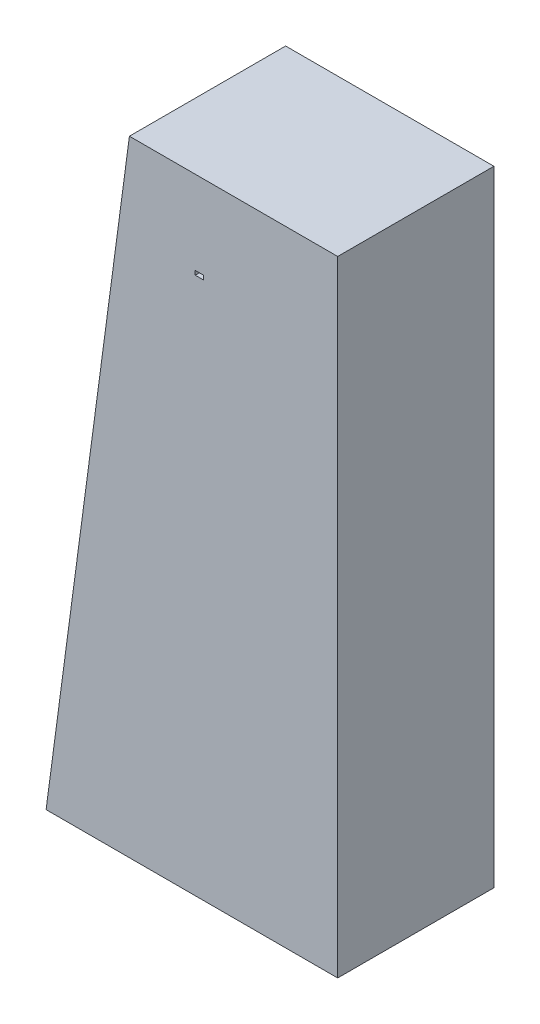
ISO-10303-21;
HEADER;
FILE_DESCRIPTION(('STEP AP214'),'2;1');
FILE_NAME('part.step','',(''),(''),'','','');
FILE_SCHEMA(('AUTOMOTIVE_DESIGN { 1 0 10303 214 1 1 1 1 }'));
ENDSEC;
DATA;
#1=APPLICATION_CONTEXT('core data for automotive mechanical design processes');
#2=APPLICATION_PROTOCOL_DEFINITION('international standard','automotive_design',2000,#1);
#3=PRODUCT_CONTEXT('',#1,'mechanical');
#4=PRODUCT('Part','Part','',(#3));
#5=PRODUCT_RELATED_PRODUCT_CATEGORY('part','',(#4));
#6=PRODUCT_DEFINITION_FORMATION('','',#4);
#7=PRODUCT_DEFINITION_CONTEXT('part definition',#1,'design');
#8=PRODUCT_DEFINITION('design','',#6,#7);
#9=PRODUCT_DEFINITION_SHAPE('','',#8);
#10=(LENGTH_UNIT() NAMED_UNIT(*) SI_UNIT(.MILLI.,.METRE.));
#11=(NAMED_UNIT(*) PLANE_ANGLE_UNIT() SI_UNIT($,.RADIAN.));
#12=(NAMED_UNIT(*) SI_UNIT($,.STERADIAN.) SOLID_ANGLE_UNIT());
#13=UNCERTAINTY_MEASURE_WITH_UNIT(LENGTH_MEASURE(1.E-05),#10,'distance_accuracy_value','');
#14=(GEOMETRIC_REPRESENTATION_CONTEXT(3) GLOBAL_UNCERTAINTY_ASSIGNED_CONTEXT((#13)) GLOBAL_UNIT_ASSIGNED_CONTEXT((#10,
#11,#12)) REPRESENTATION_CONTEXT('',''));
#15=CARTESIAN_POINT('',(0.,0.,0.));
#16=DIRECTION('',(0.,0.,1.));
#17=DIRECTION('',(1.,0.,0.));
#18=AXIS2_PLACEMENT_3D('',#15,#16,#17);
#19=CARTESIAN_POINT('',(20.,150.,18.75));
#20=DIRECTION('',(0.,1.,0.));
#21=DIRECTION('',(0.,0.,1.));
#22=AXIS2_PLACEMENT_3D('',#19,#20,#21);
#23=PLANE('',#22);
#24=DIRECTION('',(1.,0.,0.));
#25=VECTOR('',#24,1.);
#26=CARTESIAN_POINT('',(20.,150.,-18.75));
#27=LINE('',#26,#25);
#28=CARTESIAN_POINT('',(20.,150.,-18.75));
#29=VERTEX_POINT('',#28);
#30=CARTESIAN_POINT('',(70.,150.,-18.75));
#31=VERTEX_POINT('',#30);
#32=EDGE_CURVE('E188',#29,#31,#27,.T.);
#33=ORIENTED_EDGE('',*,*,#32,.F.);
#34=DIRECTION('',(0.,0.,-1.));
#35=VECTOR('',#34,1.);
#36=CARTESIAN_POINT('',(20.,150.,18.75));
#37=LINE('',#36,#35);
#38=CARTESIAN_POINT('',(20.,150.,18.75));
#39=VERTEX_POINT('',#38);
#40=EDGE_CURVE('E11',#39,#29,#37,.T.);
#41=ORIENTED_EDGE('',*,*,#40,.F.);
#42=DIRECTION('',(1.,0.,0.));
#43=VECTOR('',#42,1.);
#44=CARTESIAN_POINT('',(20.,150.,18.75));
#45=LINE('',#44,#43);
#46=CARTESIAN_POINT('',(70.,150.,18.75));
#47=VERTEX_POINT('',#46);
#48=EDGE_CURVE('E194',#39,#47,#45,.T.);
#49=ORIENTED_EDGE('',*,*,#48,.T.);
#50=DIRECTION('',(0.,0.,-1.));
#51=VECTOR('',#50,1.);
#52=CARTESIAN_POINT('',(70.,150.,18.75));
#53=LINE('',#52,#51);
#54=EDGE_CURVE('E39',#47,#31,#53,.T.);
#55=ORIENTED_EDGE('',*,*,#54,.T.);
#56=EDGE_LOOP('',(#33,#41,#49,#55));
#57=FACE_BOUND('',#56,.T.);
#58=ADVANCED_FACE('F36',(#57),#23,.T.);
#59=CARTESIAN_POINT('',(0.,0.,18.75));
#60=DIRECTION('',(-0.991227900682635,0.132163720091018,0.));
#61=DIRECTION('',(-0.132163720091018,-0.991227900682635,0.));
#62=AXIS2_PLACEMENT_3D('',#59,#60,#61);
#63=PLANE('',#62);
#64=DIRECTION('',(0.132163720091018,0.991227900682635,0.));
#65=VECTOR('',#64,1.);
#66=CARTESIAN_POINT('',(0.,0.,-18.75));
#67=LINE('',#66,#65);
#68=CARTESIAN_POINT('',(0.,0.,-18.75));
#69=VERTEX_POINT('',#68);
#70=EDGE_CURVE('E198',#69,#29,#67,.T.);
#71=ORIENTED_EDGE('',*,*,#70,.F.);
#72=DIRECTION('',(0.,0.,-1.));
#73=VECTOR('',#72,1.);
#74=CARTESIAN_POINT('',(0.,0.,18.75));
#75=LINE('',#74,#73);
#76=CARTESIAN_POINT('',(0.,0.,18.75));
#77=VERTEX_POINT('',#76);
#78=EDGE_CURVE('E44',#77,#69,#75,.T.);
#79=ORIENTED_EDGE('',*,*,#78,.F.);
#80=DIRECTION('',(0.132163720091018,0.991227900682635,0.));
#81=VECTOR('',#80,1.);
#82=CARTESIAN_POINT('',(0.,0.,18.75));
#83=LINE('',#82,#81);
#84=EDGE_CURVE('E203',#77,#39,#83,.T.);
#85=ORIENTED_EDGE('',*,*,#84,.T.);
#86=ORIENTED_EDGE('',*,*,#40,.T.);
#87=EDGE_LOOP('',(#71,#79,#85,#86));
#88=FACE_BOUND('',#87,.T.);
#89=ADVANCED_FACE('F230',(#88),#63,.T.);
#90=CARTESIAN_POINT('',(0.,0.,18.75));
#91=DIRECTION('',(0.,1.,0.));
#92=DIRECTION('',(-1.,0.,0.));
#93=AXIS2_PLACEMENT_3D('',#90,#91,#92);
#94=PLANE('',#93);
#95=DIRECTION('',(1.,0.,0.));
#96=VECTOR('',#95,1.);
#97=CARTESIAN_POINT('',(0.,0.,-18.75));
#98=LINE('',#97,#96);
#99=CARTESIAN_POINT('',(70.,0.,-18.75));
#100=VERTEX_POINT('',#99);
#101=EDGE_CURVE('E211',#69,#100,#98,.T.);
#102=ORIENTED_EDGE('',*,*,#101,.T.);
#103=DIRECTION('',(0.,0.,-1.));
#104=VECTOR('',#103,1.);
#105=CARTESIAN_POINT('',(70.,0.,18.75));
#106=LINE('',#105,#104);
#107=CARTESIAN_POINT('',(70.,0.,18.75));
#108=VERTEX_POINT('',#107);
#109=EDGE_CURVE('E216',#108,#100,#106,.T.);
#110=ORIENTED_EDGE('',*,*,#109,.F.);
#111=DIRECTION('',(1.,0.,0.));
#112=VECTOR('',#111,1.);
#113=CARTESIAN_POINT('',(0.,0.,18.75));
#114=LINE('',#113,#112);
#115=EDGE_CURVE('E201',#77,#108,#114,.T.);
#116=ORIENTED_EDGE('',*,*,#115,.F.);
#117=ORIENTED_EDGE('',*,*,#78,.T.);
#118=EDGE_LOOP('',(#102,#110,#116,#117));
#119=FACE_BOUND('',#118,.T.);
#120=ADVANCED_FACE('F236',(#119),#94,.F.);
#121=CARTESIAN_POINT('',(70.,150.,18.75));
#122=DIRECTION('',(1.,0.,0.));
#123=DIRECTION('',(0.,1.,0.));
#124=AXIS2_PLACEMENT_3D('',#121,#122,#123);
#125=PLANE('',#124);
#126=DIRECTION('',(0.,-1.,0.));
#127=VECTOR('',#126,1.);
#128=CARTESIAN_POINT('',(70.,150.,-18.75));
#129=LINE('',#128,#127);
#130=EDGE_CURVE('E208',#31,#100,#129,.T.);
#131=ORIENTED_EDGE('',*,*,#130,.F.);
#132=ORIENTED_EDGE('',*,*,#54,.F.);
#133=DIRECTION('',(0.,-1.,0.));
#134=VECTOR('',#133,1.);
#135=CARTESIAN_POINT('',(70.,150.,18.75));
#136=LINE('',#135,#134);
#137=EDGE_CURVE('E197',#47,#108,#136,.T.);
#138=ORIENTED_EDGE('',*,*,#137,.T.);
#139=ORIENTED_EDGE('',*,*,#109,.T.);
#140=EDGE_LOOP('',(#131,#132,#138,#139));
#141=FACE_BOUND('',#140,.T.);
#142=ADVANCED_FACE('F224',(#141),#125,.T.);
#143=CARTESIAN_POINT('',(0.,0.,18.75));
#144=DIRECTION('',(0.,0.,-1.));
#145=DIRECTION('',(-1.,0.,0.));
#146=AXIS2_PLACEMENT_3D('',#143,#144,#145);
#147=PLANE('',#146);
#148=DIRECTION('',(-1.,0.,0.));
#149=VECTOR('',#148,1.);
#150=CARTESIAN_POINT('',(35.8,130.,18.75));
#151=LINE('',#150,#149);
#152=CARTESIAN_POINT('',(37.8,130.,18.75));
#153=VERTEX_POINT('',#152);
#154=CARTESIAN_POINT('',(35.8,130.,18.75));
#155=VERTEX_POINT('',#154);
#156=EDGE_CURVE('E154',#153,#155,#151,.T.);
#157=ORIENTED_EDGE('',*,*,#156,.F.);
#158=DIRECTION('',(0.,1.,0.));
#159=VECTOR('',#158,1.);
#160=CARTESIAN_POINT('',(37.8,130.,18.75));
#161=LINE('',#160,#159);
#162=CARTESIAN_POINT('',(37.8,129.,18.75));
#163=VERTEX_POINT('',#162);
#164=EDGE_CURVE('E52',#163,#153,#161,.T.);
#165=ORIENTED_EDGE('',*,*,#164,.F.);
#166=DIRECTION('',(1.,0.,0.));
#167=VECTOR('',#166,1.);
#168=CARTESIAN_POINT('',(35.8,129.,18.75));
#169=LINE('',#168,#167);
#170=CARTESIAN_POINT('',(35.8,129.,18.75));
#171=VERTEX_POINT('',#170);
#172=EDGE_CURVE('E145',#171,#163,#169,.T.);
#173=ORIENTED_EDGE('',*,*,#172,.F.);
#174=DIRECTION('',(0.,-1.,0.));
#175=VECTOR('',#174,1.);
#176=CARTESIAN_POINT('',(35.8,130.,18.75));
#177=LINE('',#176,#175);
#178=EDGE_CURVE('E148',#155,#171,#177,.T.);
#179=ORIENTED_EDGE('',*,*,#178,.F.);
#180=EDGE_LOOP('',(#157,#165,#173,#179));
#181=FACE_BOUND('',#180,.T.);
#182=ORIENTED_EDGE('',*,*,#48,.F.);
#183=ORIENTED_EDGE('',*,*,#84,.F.);
#184=ORIENTED_EDGE('',*,*,#115,.T.);
#185=ORIENTED_EDGE('',*,*,#137,.F.);
#186=EDGE_LOOP('',(#182,#183,#184,#185));
#187=FACE_BOUND('',#186,.T.);
#188=ADVANCED_FACE('F234',(#181,#187),#147,.F.);
#189=CARTESIAN_POINT('',(0.,0.,-18.75));
#190=DIRECTION('',(0.,0.,-1.));
#191=DIRECTION('',(-1.,0.,0.));
#192=AXIS2_PLACEMENT_3D('',#189,#190,#191);
#193=PLANE('',#192);
#194=DIRECTION('',(0.,1.,0.));
#195=VECTOR('',#194,1.);
#196=CARTESIAN_POINT('',(35.3,130.,-18.75));
#197=LINE('',#196,#195);
#198=CARTESIAN_POINT('',(35.3,129.,-18.75));
#199=VERTEX_POINT('',#198);
#200=CARTESIAN_POINT('',(35.3,130.,-18.75));
#201=VERTEX_POINT('',#200);
#202=EDGE_CURVE('E60',#199,#201,#197,.T.);
#203=ORIENTED_EDGE('',*,*,#202,.F.);
#204=DIRECTION('',(-1.,0.,0.));
#205=VECTOR('',#204,1.);
#206=CARTESIAN_POINT('',(38.3,129.,-18.75));
#207=LINE('',#206,#205);
#208=CARTESIAN_POINT('',(38.3,129.,-18.75));
#209=VERTEX_POINT('',#208);
#210=EDGE_CURVE('E167',#209,#199,#207,.T.);
#211=ORIENTED_EDGE('',*,*,#210,.F.);
#212=DIRECTION('',(0.,-1.,0.));
#213=VECTOR('',#212,1.);
#214=CARTESIAN_POINT('',(38.3,130.,-18.75));
#215=LINE('',#214,#213);
#216=CARTESIAN_POINT('',(38.3,130.,-18.75));
#217=VERTEX_POINT('',#216);
#218=EDGE_CURVE('E181',#217,#209,#215,.T.);
#219=ORIENTED_EDGE('',*,*,#218,.F.);
#220=DIRECTION('',(1.,0.,0.));
#221=VECTOR('',#220,1.);
#222=CARTESIAN_POINT('',(38.3,130.,-18.75));
#223=LINE('',#222,#221);
#224=EDGE_CURVE('E178',#201,#217,#223,.T.);
#225=ORIENTED_EDGE('',*,*,#224,.F.);
#226=EDGE_LOOP('',(#203,#211,#219,#225));
#227=FACE_BOUND('',#226,.T.);
#228=ORIENTED_EDGE('',*,*,#32,.T.);
#229=ORIENTED_EDGE('',*,*,#130,.T.);
#230=ORIENTED_EDGE('',*,*,#101,.F.);
#231=ORIENTED_EDGE('',*,*,#70,.T.);
#232=EDGE_LOOP('',(#228,#229,#230,#231));
#233=FACE_BOUND('',#232,.T.);
#234=ADVANCED_FACE('F227',(#227,#233),#193,.T.);
#235=CARTESIAN_POINT('',(35.3,130.,-13.75));
#236=DIRECTION('',(-1.,0.,0.));
#237=DIRECTION('',(0.,0.,1.));
#238=AXIS2_PLACEMENT_3D('',#235,#236,#237);
#239=PLANE('',#238);
#240=ORIENTED_EDGE('',*,*,#202,.T.);
#241=DIRECTION('',(0.,0.,-1.));
#242=VECTOR('',#241,1.);
#243=CARTESIAN_POINT('',(35.3,130.,-13.75));
#244=LINE('',#243,#242);
#245=CARTESIAN_POINT('',(35.3,130.,-13.75));
#246=VERTEX_POINT('',#245);
#247=EDGE_CURVE('E176',#246,#201,#244,.T.);
#248=ORIENTED_EDGE('',*,*,#247,.F.);
#249=DIRECTION('',(0.,1.,0.));
#250=VECTOR('',#249,1.);
#251=CARTESIAN_POINT('',(35.3,130.,-13.75));
#252=LINE('',#251,#250);
#253=CARTESIAN_POINT('',(35.3,129.,-13.75));
#254=VERTEX_POINT('',#253);
#255=EDGE_CURVE('E163',#254,#246,#252,.T.);
#256=ORIENTED_EDGE('',*,*,#255,.F.);
#257=DIRECTION('',(0.,0.,-1.));
#258=VECTOR('',#257,1.);
#259=CARTESIAN_POINT('',(35.3,129.,-13.75));
#260=LINE('',#259,#258);
#261=EDGE_CURVE('E186',#254,#199,#260,.T.);
#262=ORIENTED_EDGE('',*,*,#261,.T.);
#263=EDGE_LOOP('',(#240,#248,#256,#262));
#264=FACE_BOUND('',#263,.T.);
#265=ADVANCED_FACE('F272',(#264),#239,.F.);
#266=CARTESIAN_POINT('',(38.3,129.,-13.75));
#267=DIRECTION('',(0.,-1.,0.));
#268=DIRECTION('',(0.,0.,-1.));
#269=AXIS2_PLACEMENT_3D('',#266,#267,#268);
#270=PLANE('',#269);
#271=ORIENTED_EDGE('',*,*,#210,.T.);
#272=ORIENTED_EDGE('',*,*,#261,.F.);
#273=DIRECTION('',(-1.,0.,0.));
#274=VECTOR('',#273,1.);
#275=CARTESIAN_POINT('',(38.3,129.,-13.75));
#276=LINE('',#275,#274);
#277=CARTESIAN_POINT('',(38.3,129.,-13.75));
#278=VERTEX_POINT('',#277);
#279=EDGE_CURVE('E173',#278,#254,#276,.T.);
#280=ORIENTED_EDGE('',*,*,#279,.F.);
#281=DIRECTION('',(0.,0.,-1.));
#282=VECTOR('',#281,1.);
#283=CARTESIAN_POINT('',(38.3,129.,-13.75));
#284=LINE('',#283,#282);
#285=EDGE_CURVE('E189',#278,#209,#284,.T.);
#286=ORIENTED_EDGE('',*,*,#285,.T.);
#287=EDGE_LOOP('',(#271,#272,#280,#286));
#288=FACE_BOUND('',#287,.T.);
#289=ADVANCED_FACE('F282',(#288),#270,.F.);
#290=CARTESIAN_POINT('',(38.3,130.,-13.75));
#291=DIRECTION('',(1.,0.,0.));
#292=DIRECTION('',(0.,0.,-1.));
#293=AXIS2_PLACEMENT_3D('',#290,#291,#292);
#294=PLANE('',#293);
#295=ORIENTED_EDGE('',*,*,#218,.T.);
#296=ORIENTED_EDGE('',*,*,#285,.F.);
#297=DIRECTION('',(0.,-1.,0.));
#298=VECTOR('',#297,1.);
#299=CARTESIAN_POINT('',(38.3,130.,-13.75));
#300=LINE('',#299,#298);
#301=CARTESIAN_POINT('',(38.3,130.,-13.75));
#302=VERTEX_POINT('',#301);
#303=EDGE_CURVE('E170',#302,#278,#300,.T.);
#304=ORIENTED_EDGE('',*,*,#303,.F.);
#305=DIRECTION('',(0.,0.,-1.));
#306=VECTOR('',#305,1.);
#307=CARTESIAN_POINT('',(38.3,130.,-13.75));
#308=LINE('',#307,#306);
#309=EDGE_CURVE('E191',#302,#217,#308,.T.);
#310=ORIENTED_EDGE('',*,*,#309,.T.);
#311=EDGE_LOOP('',(#295,#296,#304,#310));
#312=FACE_BOUND('',#311,.T.);
#313=ADVANCED_FACE('F291',(#312),#294,.F.);
#314=CARTESIAN_POINT('',(38.3,130.,-13.75));
#315=DIRECTION('',(0.,1.,0.));
#316=DIRECTION('',(0.,0.,1.));
#317=AXIS2_PLACEMENT_3D('',#314,#315,#316);
#318=PLANE('',#317);
#319=ORIENTED_EDGE('',*,*,#224,.T.);
#320=ORIENTED_EDGE('',*,*,#309,.F.);
#321=DIRECTION('',(1.,0.,0.));
#322=VECTOR('',#321,1.);
#323=CARTESIAN_POINT('',(38.3,130.,-13.75));
#324=LINE('',#323,#322);
#325=EDGE_CURVE('E166',#246,#302,#324,.T.);
#326=ORIENTED_EDGE('',*,*,#325,.F.);
#327=ORIENTED_EDGE('',*,*,#247,.T.);
#328=EDGE_LOOP('',(#319,#320,#326,#327));
#329=FACE_BOUND('',#328,.T.);
#330=ADVANCED_FACE('F301',(#329),#318,.F.);
#331=CARTESIAN_POINT('',(0.,0.,-13.75));
#332=DIRECTION('',(0.,0.,-1.));
#333=DIRECTION('',(-1.,0.,0.));
#334=AXIS2_PLACEMENT_3D('',#331,#332,#333);
#335=PLANE('',#334);
#336=ORIENTED_EDGE('',*,*,#255,.T.);
#337=ORIENTED_EDGE('',*,*,#325,.T.);
#338=ORIENTED_EDGE('',*,*,#303,.T.);
#339=ORIENTED_EDGE('',*,*,#279,.T.);
#340=EDGE_LOOP('',(#336,#337,#338,#339));
#341=FACE_BOUND('',#340,.T.);
#342=ADVANCED_FACE('F311',(#341),#335,.T.);
#343=CARTESIAN_POINT('',(37.8,130.,13.75));
#344=DIRECTION('',(1.,0.,0.));
#345=DIRECTION('',(0.,1.,0.));
#346=AXIS2_PLACEMENT_3D('',#343,#344,#345);
#347=PLANE('',#346);
#348=ORIENTED_EDGE('',*,*,#164,.T.);
#349=DIRECTION('',(0.,0.,1.));
#350=VECTOR('',#349,1.);
#351=CARTESIAN_POINT('',(37.8,130.,13.75));
#352=LINE('',#351,#350);
#353=CARTESIAN_POINT('',(37.8,130.,13.75));
#354=VERTEX_POINT('',#353);
#355=EDGE_CURVE('E123',#354,#153,#352,.T.);
#356=ORIENTED_EDGE('',*,*,#355,.F.);
#357=DIRECTION('',(0.,1.,0.));
#358=VECTOR('',#357,1.);
#359=CARTESIAN_POINT('',(37.8,130.,13.75));
#360=LINE('',#359,#358);
#361=CARTESIAN_POINT('',(37.8,129.,13.75));
#362=VERTEX_POINT('',#361);
#363=EDGE_CURVE('E127',#362,#354,#360,.T.);
#364=ORIENTED_EDGE('',*,*,#363,.F.);
#365=DIRECTION('',(0.,0.,1.));
#366=VECTOR('',#365,1.);
#367=CARTESIAN_POINT('',(37.8,129.,13.75));
#368=LINE('',#367,#366);
#369=EDGE_CURVE('E158',#362,#163,#368,.T.);
#370=ORIENTED_EDGE('',*,*,#369,.T.);
#371=EDGE_LOOP('',(#348,#356,#364,#370));
#372=FACE_BOUND('',#371,.T.);
#373=ADVANCED_FACE('F125',(#372),#347,.F.);
#374=CARTESIAN_POINT('',(35.8,129.,13.75));
#375=DIRECTION('',(0.,-1.,0.));
#376=DIRECTION('',(0.,0.,-1.));
#377=AXIS2_PLACEMENT_3D('',#374,#375,#376);
#378=PLANE('',#377);
#379=ORIENTED_EDGE('',*,*,#172,.T.);
#380=ORIENTED_EDGE('',*,*,#369,.F.);
#381=DIRECTION('',(1.,0.,0.));
#382=VECTOR('',#381,1.);
#383=CARTESIAN_POINT('',(35.8,129.,13.75));
#384=LINE('',#383,#382);
#385=CARTESIAN_POINT('',(35.8,129.,13.75));
#386=VERTEX_POINT('',#385);
#387=EDGE_CURVE('E133',#386,#362,#384,.T.);
#388=ORIENTED_EDGE('',*,*,#387,.F.);
#389=DIRECTION('',(0.,0.,1.));
#390=VECTOR('',#389,1.);
#391=CARTESIAN_POINT('',(35.8,129.,13.75));
#392=LINE('',#391,#390);
#393=EDGE_CURVE('E160',#386,#171,#392,.T.);
#394=ORIENTED_EDGE('',*,*,#393,.T.);
#395=EDGE_LOOP('',(#379,#380,#388,#394));
#396=FACE_BOUND('',#395,.T.);
#397=ADVANCED_FACE('F337',(#396),#378,.F.);
#398=CARTESIAN_POINT('',(35.8,130.,13.75));
#399=DIRECTION('',(-1.,0.,0.));
#400=DIRECTION('',(0.,0.,1.));
#401=AXIS2_PLACEMENT_3D('',#398,#399,#400);
#402=PLANE('',#401);
#403=ORIENTED_EDGE('',*,*,#178,.T.);
#404=ORIENTED_EDGE('',*,*,#393,.F.);
#405=DIRECTION('',(0.,-1.,0.));
#406=VECTOR('',#405,1.);
#407=CARTESIAN_POINT('',(35.8,130.,13.75));
#408=LINE('',#407,#406);
#409=CARTESIAN_POINT('',(35.8,130.,13.75));
#410=VERTEX_POINT('',#409);
#411=EDGE_CURVE('E141',#410,#386,#408,.T.);
#412=ORIENTED_EDGE('',*,*,#411,.F.);
#413=DIRECTION('',(0.,0.,1.));
#414=VECTOR('',#413,1.);
#415=CARTESIAN_POINT('',(35.8,130.,13.75));
#416=LINE('',#415,#414);
#417=EDGE_CURVE('E132',#410,#155,#416,.T.);
#418=ORIENTED_EDGE('',*,*,#417,.T.);
#419=EDGE_LOOP('',(#403,#404,#412,#418));
#420=FACE_BOUND('',#419,.T.);
#421=ADVANCED_FACE('F346',(#420),#402,.F.);
#422=CARTESIAN_POINT('',(35.8,130.,13.75));
#423=DIRECTION('',(0.,1.,0.));
#424=DIRECTION('',(0.,0.,1.));
#425=AXIS2_PLACEMENT_3D('',#422,#423,#424);
#426=PLANE('',#425);
#427=ORIENTED_EDGE('',*,*,#156,.T.);
#428=ORIENTED_EDGE('',*,*,#417,.F.);
#429=DIRECTION('',(-1.,0.,0.));
#430=VECTOR('',#429,1.);
#431=CARTESIAN_POINT('',(35.8,130.,13.75));
#432=LINE('',#431,#430);
#433=EDGE_CURVE('E136',#354,#410,#432,.T.);
#434=ORIENTED_EDGE('',*,*,#433,.F.);
#435=ORIENTED_EDGE('',*,*,#355,.T.);
#436=EDGE_LOOP('',(#427,#428,#434,#435));
#437=FACE_BOUND('',#436,.T.);
#438=ADVANCED_FACE('F137',(#437),#426,.F.);
#439=CARTESIAN_POINT('',(0.,0.,13.75));
#440=DIRECTION('',(0.,0.,1.));
#441=DIRECTION('',(1.,0.,0.));
#442=AXIS2_PLACEMENT_3D('',#439,#440,#441);
#443=PLANE('',#442);
#444=ORIENTED_EDGE('',*,*,#363,.T.);
#445=ORIENTED_EDGE('',*,*,#433,.T.);
#446=ORIENTED_EDGE('',*,*,#411,.T.);
#447=ORIENTED_EDGE('',*,*,#387,.T.);
#448=EDGE_LOOP('',(#444,#445,#446,#447));
#449=FACE_BOUND('',#448,.T.);
#450=ADVANCED_FACE('F143',(#449),#443,.T.);
#451=CLOSED_SHELL('',(#58,#89,#120,#142,#188,#234,#265,#289,#313,#330,#342,#373,#397,#421,#438,#450));
#452=MANIFOLD_SOLID_BREP('B2',#451);
#453=ADVANCED_BREP_SHAPE_REPRESENTATION('',(#18,#452),#14);
#454=SHAPE_DEFINITION_REPRESENTATION(#9,#453);
ENDSEC;
END-ISO-10303-21;
